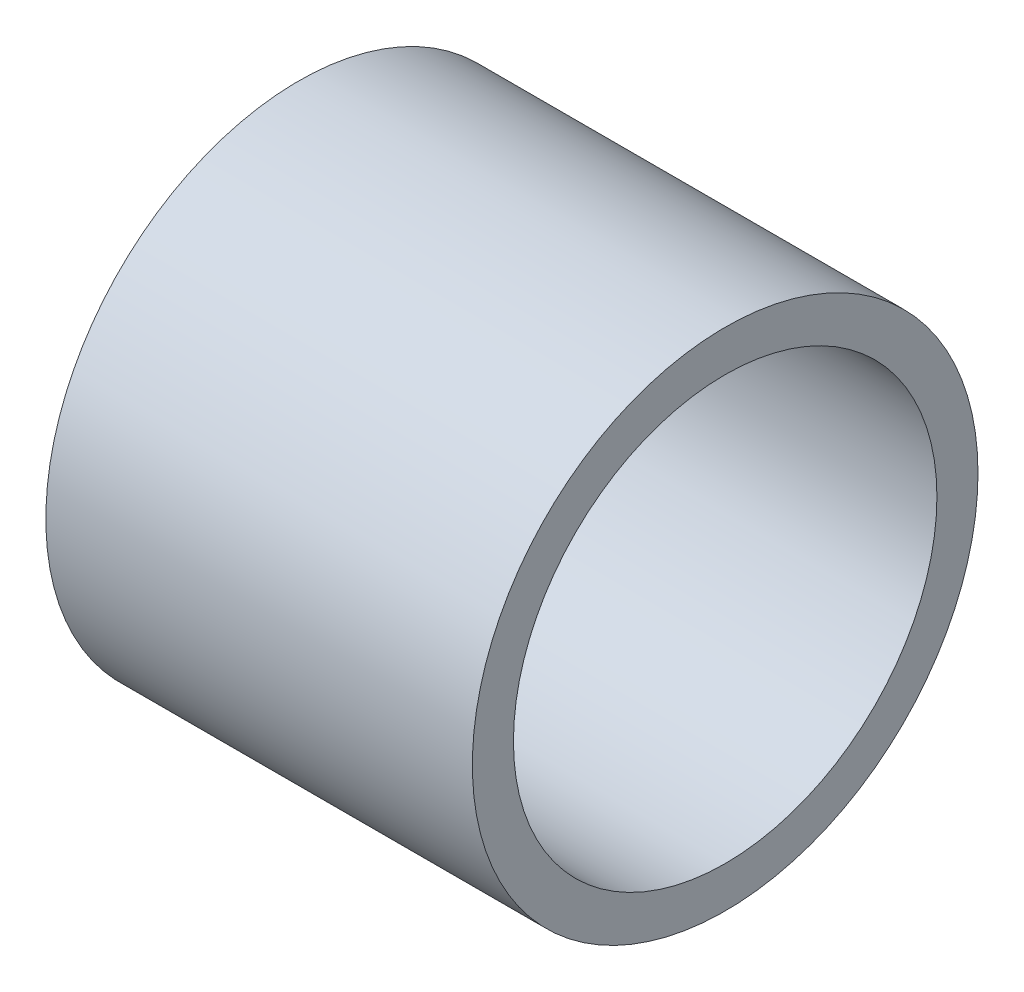
ISO-10303-21;
HEADER;
FILE_DESCRIPTION(('STEP AP214'),'2;1');
FILE_NAME('part.step','',(''),(''),'','','');
FILE_SCHEMA(('AUTOMOTIVE_DESIGN { 1 0 10303 214 1 1 1 1 }'));
ENDSEC;
DATA;
#1=APPLICATION_CONTEXT('core data for automotive mechanical design processes');
#2=APPLICATION_PROTOCOL_DEFINITION('international standard','automotive_design',2000,#1);
#3=PRODUCT_CONTEXT('',#1,'mechanical');
#4=PRODUCT('Part','Part','',(#3));
#5=PRODUCT_RELATED_PRODUCT_CATEGORY('part','',(#4));
#6=PRODUCT_DEFINITION_FORMATION('','',#4);
#7=PRODUCT_DEFINITION_CONTEXT('part definition',#1,'design');
#8=PRODUCT_DEFINITION('design','',#6,#7);
#9=PRODUCT_DEFINITION_SHAPE('','',#8);
#10=(LENGTH_UNIT() NAMED_UNIT(*) SI_UNIT(.MILLI.,.METRE.));
#11=(NAMED_UNIT(*) PLANE_ANGLE_UNIT() SI_UNIT($,.RADIAN.));
#12=(NAMED_UNIT(*) SI_UNIT($,.STERADIAN.) SOLID_ANGLE_UNIT());
#13=UNCERTAINTY_MEASURE_WITH_UNIT(LENGTH_MEASURE(1.E-05),#10,'distance_accuracy_value','');
#14=(GEOMETRIC_REPRESENTATION_CONTEXT(3) GLOBAL_UNCERTAINTY_ASSIGNED_CONTEXT((#13)) GLOBAL_UNIT_ASSIGNED_CONTEXT((#10,
#11,#12)) REPRESENTATION_CONTEXT('',''));
#15=CARTESIAN_POINT('',(0.,0.,0.));
#16=DIRECTION('',(0.,0.,1.));
#17=DIRECTION('',(1.,0.,0.));
#18=AXIS2_PLACEMENT_3D('',#15,#16,#17);
#19=CARTESIAN_POINT('',(32.1818,0.,0.));
#20=DIRECTION('',(1.,0.,0.));
#21=DIRECTION('',(0.,0.,-1.));
#22=AXIS2_PLACEMENT_3D('',#19,#20,#21);
#23=PLANE('',#22);
#24=CARTESIAN_POINT('',(32.1818,0.,0.));
#25=DIRECTION('',(1.,0.,0.));
#26=DIRECTION('',(0.,0.,-1.));
#27=AXIS2_PLACEMENT_3D('',#24,#25,#26);
#28=CIRCLE('',#27,19.0754);
#29=CARTESIAN_POINT('',(32.1818,0.,-19.0754));
#30=VERTEX_POINT('',#29);
#31=EDGE_CURVE('E10',#30,#30,#28,.T.);
#32=ORIENTED_EDGE('',*,*,#31,.T.);
#33=EDGE_LOOP('',(#32));
#34=FACE_BOUND('',#33,.T.);
#35=CARTESIAN_POINT('',(32.1818,0.,0.));
#36=DIRECTION('',(1.,0.,0.));
#37=DIRECTION('',(0.,0.,-1.));
#38=AXIS2_PLACEMENT_3D('',#35,#36,#37);
#39=CIRCLE('',#38,15.9766);
#40=CARTESIAN_POINT('',(32.1818,0.,-15.9766));
#41=VERTEX_POINT('',#40);
#42=EDGE_CURVE('E43',#41,#41,#39,.T.);
#43=ORIENTED_EDGE('',*,*,#42,.F.);
#44=EDGE_LOOP('',(#43));
#45=FACE_BOUND('',#44,.T.);
#46=ADVANCED_FACE('F32',(#34,#45),#23,.T.);
#47=CARTESIAN_POINT('',(0.,0.,0.));
#48=DIRECTION('',(1.,0.,0.));
#49=DIRECTION('',(0.,0.,-1.));
#50=AXIS2_PLACEMENT_3D('',#47,#48,#49);
#51=PLANE('',#50);
#52=CARTESIAN_POINT('',(0.,0.,0.));
#53=DIRECTION('',(1.,0.,0.));
#54=DIRECTION('',(0.,0.,-1.));
#55=AXIS2_PLACEMENT_3D('',#52,#53,#54);
#56=CIRCLE('',#55,19.0754);
#57=CARTESIAN_POINT('',(0.,0.,-19.0754));
#58=VERTEX_POINT('',#57);
#59=EDGE_CURVE('E39',#58,#58,#56,.T.);
#60=ORIENTED_EDGE('',*,*,#59,.F.);
#61=EDGE_LOOP('',(#60));
#62=FACE_BOUND('',#61,.T.);
#63=CARTESIAN_POINT('',(0.,0.,0.));
#64=DIRECTION('',(1.,0.,0.));
#65=DIRECTION('',(0.,0.,-1.));
#66=AXIS2_PLACEMENT_3D('',#63,#64,#65);
#67=CIRCLE('',#66,15.9766);
#68=CARTESIAN_POINT('',(0.,0.,-15.9766));
#69=VERTEX_POINT('',#68);
#70=EDGE_CURVE('E47',#69,#69,#67,.T.);
#71=ORIENTED_EDGE('',*,*,#70,.T.);
#72=EDGE_LOOP('',(#71));
#73=FACE_BOUND('',#72,.T.);
#74=ADVANCED_FACE('F53',(#62,#73),#51,.F.);
#75=CARTESIAN_POINT('',(32.1818,0.,0.));
#76=DIRECTION('',(-1.,0.,0.));
#77=DIRECTION('',(0.,0.,1.));
#78=AXIS2_PLACEMENT_3D('',#75,#76,#77);
#79=CYLINDRICAL_SURFACE('',#78,19.0754);
#80=ORIENTED_EDGE('',*,*,#31,.F.);
#81=EDGE_LOOP('',(#80));
#82=FACE_BOUND('',#81,.T.);
#83=ORIENTED_EDGE('',*,*,#59,.T.);
#84=EDGE_LOOP('',(#83));
#85=FACE_BOUND('',#84,.T.);
#86=ADVANCED_FACE('F34',(#82,#85),#79,.T.);
#87=CARTESIAN_POINT('',(32.1818,0.,0.));
#88=DIRECTION('',(-1.,0.,0.));
#89=DIRECTION('',(0.,0.,1.));
#90=AXIS2_PLACEMENT_3D('',#87,#88,#89);
#91=CYLINDRICAL_SURFACE('',#90,15.9766);
#92=ORIENTED_EDGE('',*,*,#42,.T.);
#93=EDGE_LOOP('',(#92));
#94=FACE_BOUND('',#93,.T.);
#95=ORIENTED_EDGE('',*,*,#70,.F.);
#96=EDGE_LOOP('',(#95));
#97=FACE_BOUND('',#96,.T.);
#98=ADVANCED_FACE('F55',(#94,#97),#91,.F.);
#99=CLOSED_SHELL('',(#46,#74,#86,#98));
#100=MANIFOLD_SOLID_BREP('B2',#99);
#101=ADVANCED_BREP_SHAPE_REPRESENTATION('',(#18,#100),#14);
#102=SHAPE_DEFINITION_REPRESENTATION(#9,#101);
ENDSEC;
END-ISO-10303-21;
